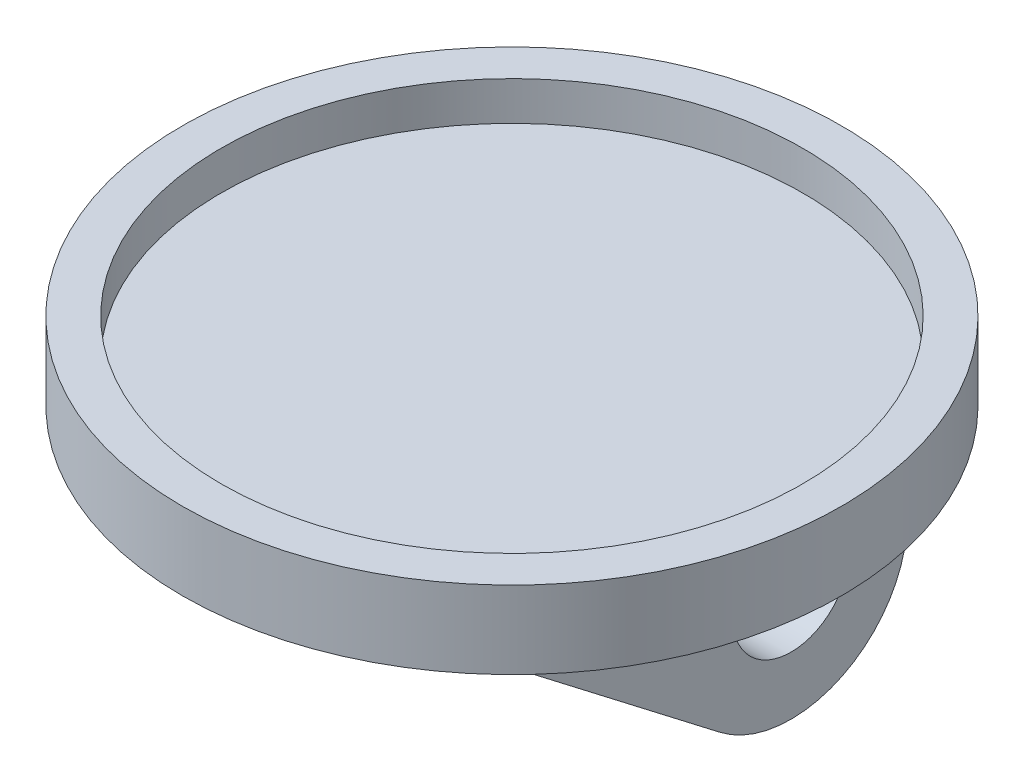
ISO-10303-21;
HEADER;
FILE_DESCRIPTION(('STEP AP214'),'2;1');
FILE_NAME('part.step','',(''),(''),'','','');
FILE_SCHEMA(('AUTOMOTIVE_DESIGN { 1 0 10303 214 1 1 1 1 }'));
ENDSEC;
DATA;
#1=APPLICATION_CONTEXT('core data for automotive mechanical design processes');
#2=APPLICATION_PROTOCOL_DEFINITION('international standard','automotive_design',2000,#1);
#3=PRODUCT_CONTEXT('',#1,'mechanical');
#4=PRODUCT('Part','Part','',(#3));
#5=PRODUCT_RELATED_PRODUCT_CATEGORY('part','',(#4));
#6=PRODUCT_DEFINITION_FORMATION('','',#4);
#7=PRODUCT_DEFINITION_CONTEXT('part definition',#1,'design');
#8=PRODUCT_DEFINITION('design','',#6,#7);
#9=PRODUCT_DEFINITION_SHAPE('','',#8);
#10=(LENGTH_UNIT() NAMED_UNIT(*) SI_UNIT(.MILLI.,.METRE.));
#11=(NAMED_UNIT(*) PLANE_ANGLE_UNIT() SI_UNIT($,.RADIAN.));
#12=(NAMED_UNIT(*) SI_UNIT($,.STERADIAN.) SOLID_ANGLE_UNIT());
#13=UNCERTAINTY_MEASURE_WITH_UNIT(LENGTH_MEASURE(1.E-05),#10,'distance_accuracy_value','');
#14=(GEOMETRIC_REPRESENTATION_CONTEXT(3) GLOBAL_UNCERTAINTY_ASSIGNED_CONTEXT((#13)) GLOBAL_UNIT_ASSIGNED_CONTEXT((#10,
#11,#12)) REPRESENTATION_CONTEXT('',''));
#15=CARTESIAN_POINT('',(0.,0.,0.));
#16=DIRECTION('',(0.,0.,1.));
#17=DIRECTION('',(1.,0.,0.));
#18=AXIS2_PLACEMENT_3D('',#15,#16,#17);
#19=CARTESIAN_POINT('',(0.,0.,0.));
#20=DIRECTION('',(0.,1.,0.));
#21=DIRECTION('',(0.,0.,1.));
#22=AXIS2_PLACEMENT_3D('',#19,#20,#21);
#23=PLANE('',#22);
#24=DIRECTION('',(-1.,0.,0.));
#25=VECTOR('',#24,1.);
#26=CARTESIAN_POINT('',(37.,0.,-65.));
#27=LINE('',#26,#25);
#28=CARTESIAN_POINT('',(37.,0.,-65.));
#29=VERTEX_POINT('',#28);
#30=CARTESIAN_POINT('',(17.,0.,-65.));
#31=VERTEX_POINT('',#30);
#32=EDGE_CURVE('E152',#29,#31,#27,.T.);
#33=ORIENTED_EDGE('',*,*,#32,.T.);
#34=DIRECTION('',(0.,0.,1.));
#35=VECTOR('',#34,1.);
#36=CARTESIAN_POINT('',(17.,0.,65.));
#37=LINE('',#36,#35);
#38=CARTESIAN_POINT('',(17.,0.,65.));
#39=VERTEX_POINT('',#38);
#40=EDGE_CURVE('E146',#31,#39,#37,.T.);
#41=ORIENTED_EDGE('',*,*,#40,.T.);
#42=DIRECTION('',(-1.,0.,0.));
#43=VECTOR('',#42,1.);
#44=CARTESIAN_POINT('',(37.,0.,65.));
#45=LINE('',#44,#43);
#46=CARTESIAN_POINT('',(37.,0.,65.));
#47=VERTEX_POINT('',#46);
#48=EDGE_CURVE('E144',#47,#39,#45,.T.);
#49=ORIENTED_EDGE('',*,*,#48,.F.);
#50=DIRECTION('',(0.,0.,1.));
#51=VECTOR('',#50,1.);
#52=CARTESIAN_POINT('',(37.,0.,65.));
#53=LINE('',#52,#51);
#54=EDGE_CURVE('E137',#29,#47,#53,.T.);
#55=ORIENTED_EDGE('',*,*,#54,.F.);
#56=EDGE_LOOP('',(#33,#41,#49,#55));
#57=FACE_BOUND('',#56,.T.);
#58=CARTESIAN_POINT('',(0.,0.,0.));
#59=DIRECTION('',(0.,1.,0.));
#60=DIRECTION('',(0.,0.,1.));
#61=AXIS2_PLACEMENT_3D('',#58,#59,#60);
#62=CIRCLE('',#61,85.);
#63=CARTESIAN_POINT('',(0.,0.,85.));
#64=VERTEX_POINT('',#63);
#65=EDGE_CURVE('E161',#64,#64,#62,.T.);
#66=ORIENTED_EDGE('',*,*,#65,.F.);
#67=EDGE_LOOP('',(#66));
#68=FACE_BOUND('',#67,.T.);
#69=DIRECTION('',(0.,0.,1.));
#70=VECTOR('',#69,1.);
#71=CARTESIAN_POINT('',(-37.,0.,65.));
#72=LINE('',#71,#70);
#73=CARTESIAN_POINT('',(-37.,0.,-65.));
#74=VERTEX_POINT('',#73);
#75=CARTESIAN_POINT('',(-37.,0.,65.));
#76=VERTEX_POINT('',#75);
#77=EDGE_CURVE('E110',#74,#76,#72,.T.);
#78=ORIENTED_EDGE('',*,*,#77,.T.);
#79=DIRECTION('',(1.,0.,0.));
#80=VECTOR('',#79,1.);
#81=CARTESIAN_POINT('',(-37.,0.,65.));
#82=LINE('',#81,#80);
#83=CARTESIAN_POINT('',(-17.,0.,65.));
#84=VERTEX_POINT('',#83);
#85=EDGE_CURVE('E122',#76,#84,#82,.T.);
#86=ORIENTED_EDGE('',*,*,#85,.T.);
#87=DIRECTION('',(0.,0.,1.));
#88=VECTOR('',#87,1.);
#89=CARTESIAN_POINT('',(-17.,0.,65.));
#90=LINE('',#89,#88);
#91=CARTESIAN_POINT('',(-17.,0.,-65.));
#92=VERTEX_POINT('',#91);
#93=EDGE_CURVE('E121',#92,#84,#90,.T.);
#94=ORIENTED_EDGE('',*,*,#93,.F.);
#95=DIRECTION('',(1.,0.,0.));
#96=VECTOR('',#95,1.);
#97=CARTESIAN_POINT('',(-37.,0.,-65.));
#98=LINE('',#97,#96);
#99=EDGE_CURVE('E106',#74,#92,#98,.T.);
#100=ORIENTED_EDGE('',*,*,#99,.F.);
#101=EDGE_LOOP('',(#78,#86,#94,#100));
#102=FACE_BOUND('',#101,.T.);
#103=ADVANCED_FACE('F41',(#57,#68,#102),#23,.F.);
#104=CARTESIAN_POINT('',(0.,20.,0.));
#105=DIRECTION('',(0.,-1.,0.));
#106=DIRECTION('',(0.,0.,-1.));
#107=AXIS2_PLACEMENT_3D('',#104,#105,#106);
#108=CYLINDRICAL_SURFACE('',#107,85.);
#109=CARTESIAN_POINT('',(0.,20.,0.));
#110=DIRECTION('',(0.,1.,0.));
#111=DIRECTION('',(0.,0.,1.));
#112=AXIS2_PLACEMENT_3D('',#109,#110,#111);
#113=CIRCLE('',#112,85.);
#114=CARTESIAN_POINT('',(0.,20.,85.));
#115=VERTEX_POINT('',#114);
#116=EDGE_CURVE('E162',#115,#115,#113,.T.);
#117=ORIENTED_EDGE('',*,*,#116,.F.);
#118=EDGE_LOOP('',(#117));
#119=FACE_BOUND('',#118,.T.);
#120=ORIENTED_EDGE('',*,*,#65,.T.);
#121=EDGE_LOOP('',(#120));
#122=FACE_BOUND('',#121,.T.);
#123=ADVANCED_FACE('F212',(#119,#122),#108,.T.);
#124=CARTESIAN_POINT('',(0.,20.,0.));
#125=DIRECTION('',(0.,1.,0.));
#126=DIRECTION('',(0.,0.,1.));
#127=AXIS2_PLACEMENT_3D('',#124,#125,#126);
#128=PLANE('',#127);
#129=CARTESIAN_POINT('',(0.,20.,0.));
#130=DIRECTION('',(0.,1.,0.));
#131=DIRECTION('',(0.,0.,1.));
#132=AXIS2_PLACEMENT_3D('',#129,#130,#131);
#133=CIRCLE('',#132,75.);
#134=CARTESIAN_POINT('',(0.,20.,75.));
#135=VERTEX_POINT('',#134);
#136=EDGE_CURVE('E158',#135,#135,#133,.T.);
#137=ORIENTED_EDGE('',*,*,#136,.F.);
#138=EDGE_LOOP('',(#137));
#139=FACE_BOUND('',#138,.T.);
#140=ORIENTED_EDGE('',*,*,#116,.T.);
#141=EDGE_LOOP('',(#140));
#142=FACE_BOUND('',#141,.T.);
#143=ADVANCED_FACE('F218',(#139,#142),#128,.T.);
#144=CARTESIAN_POINT('',(0.,20.,0.));
#145=DIRECTION('',(0.,-1.,0.));
#146=DIRECTION('',(0.,0.,-1.));
#147=AXIS2_PLACEMENT_3D('',#144,#145,#146);
#148=CYLINDRICAL_SURFACE('',#147,75.);
#149=ORIENTED_EDGE('',*,*,#136,.T.);
#150=EDGE_LOOP('',(#149));
#151=FACE_BOUND('',#150,.T.);
#152=CARTESIAN_POINT('',(0.,10.,0.));
#153=DIRECTION('',(0.,1.,0.));
#154=DIRECTION('',(0.,0.,1.));
#155=AXIS2_PLACEMENT_3D('',#152,#153,#154);
#156=CIRCLE('',#155,75.);
#157=CARTESIAN_POINT('',(0.,10.,75.));
#158=VERTEX_POINT('',#157);
#159=EDGE_CURVE('E155',#158,#158,#156,.T.);
#160=ORIENTED_EDGE('',*,*,#159,.F.);
#161=EDGE_LOOP('',(#160));
#162=FACE_BOUND('',#161,.T.);
#163=ADVANCED_FACE('F262',(#151,#162),#148,.F.);
#164=CARTESIAN_POINT('',(0.,10.,0.));
#165=DIRECTION('',(0.,1.,0.));
#166=DIRECTION('',(0.,0.,1.));
#167=AXIS2_PLACEMENT_3D('',#164,#165,#166);
#168=PLANE('',#167);
#169=ORIENTED_EDGE('',*,*,#159,.T.);
#170=EDGE_LOOP('',(#169));
#171=FACE_BOUND('',#170,.T.);
#172=ADVANCED_FACE('F264',(#171),#168,.T.);
#173=CARTESIAN_POINT('',(37.,0.,0.));
#174=DIRECTION('',(1.,0.,0.));
#175=DIRECTION('',(0.,0.,-1.));
#176=AXIS2_PLACEMENT_3D('',#173,#174,#175);
#177=PLANE('',#176);
#178=DIRECTION('',(0.,-0.609710760849692,-0.7926239891046));
#179=VECTOR('',#178,1.);
#180=CARTESIAN_POINT('',(37.,-100.,-65.));
#181=LINE('',#180,#179);
#182=CARTESIAN_POINT('',(37.,-62.8528285957764,-16.7086771745092));
#183=VERTEX_POINT('',#182);
#184=EDGE_CURVE('E141',#47,#183,#181,.T.);
#185=ORIENTED_EDGE('',*,*,#184,.T.);
#186=CARTESIAN_POINT('',(37.,-39.0741089226384,-35.));
#187=DIRECTION('',(1.,0.,0.));
#188=DIRECTION('',(0.,0.,-1.));
#189=AXIS2_PLACEMENT_3D('',#186,#187,#188);
#190=CIRCLE('',#189,30.);
#191=CARTESIAN_POINT('',(37.,-39.0741089226384,-65.));
#192=VERTEX_POINT('',#191);
#193=EDGE_CURVE('E174',#183,#192,#190,.T.);
#194=ORIENTED_EDGE('',*,*,#193,.T.);
#195=DIRECTION('',(0.,1.,0.));
#196=VECTOR('',#195,1.);
#197=CARTESIAN_POINT('',(37.,0.,-65.));
#198=LINE('',#197,#196);
#199=EDGE_CURVE('E135',#192,#29,#198,.T.);
#200=ORIENTED_EDGE('',*,*,#199,.T.);
#201=ORIENTED_EDGE('',*,*,#54,.T.);
#202=EDGE_LOOP('',(#185,#194,#200,#201));
#203=FACE_BOUND('',#202,.T.);
#204=CARTESIAN_POINT('',(37.,-39.0741089226383,-35.));
#205=DIRECTION('',(1.,0.,0.));
#206=DIRECTION('',(0.,0.,-1.));
#207=AXIS2_PLACEMENT_3D('',#204,#205,#206);
#208=CIRCLE('',#207,15.);
#209=CARTESIAN_POINT('',(37.,-39.0741089226383,-50.));
#210=VERTEX_POINT('',#209);
#211=EDGE_CURVE('E129',#210,#210,#208,.T.);
#212=ORIENTED_EDGE('',*,*,#211,.F.);
#213=EDGE_LOOP('',(#212));
#214=FACE_BOUND('',#213,.T.);
#215=ADVANCED_FACE('F234',(#203,#214),#177,.T.);
#216=CARTESIAN_POINT('',(17.,0.,0.));
#217=DIRECTION('',(1.,0.,0.));
#218=DIRECTION('',(0.,0.,-1.));
#219=AXIS2_PLACEMENT_3D('',#216,#217,#218);
#220=PLANE('',#219);
#221=DIRECTION('',(0.,1.,0.));
#222=VECTOR('',#221,1.);
#223=CARTESIAN_POINT('',(17.,0.,-65.));
#224=LINE('',#223,#222);
#225=CARTESIAN_POINT('',(17.,-39.0741089226384,-65.));
#226=VERTEX_POINT('',#225);
#227=EDGE_CURVE('E132',#226,#31,#224,.T.);
#228=ORIENTED_EDGE('',*,*,#227,.F.);
#229=CARTESIAN_POINT('',(17.,-39.0741089226384,-35.));
#230=DIRECTION('',(1.,0.,0.));
#231=DIRECTION('',(0.,0.,-1.));
#232=AXIS2_PLACEMENT_3D('',#229,#230,#231);
#233=CIRCLE('',#232,30.);
#234=CARTESIAN_POINT('',(17.,-62.8528285957764,-16.7086771745092));
#235=VERTEX_POINT('',#234);
#236=EDGE_CURVE('E170',#226,#235,#233,.F.);
#237=ORIENTED_EDGE('',*,*,#236,.T.);
#238=DIRECTION('',(0.,-0.609710760849692,-0.7926239891046));
#239=VECTOR('',#238,1.);
#240=CARTESIAN_POINT('',(17.,-100.,-65.));
#241=LINE('',#240,#239);
#242=EDGE_CURVE('E138',#39,#235,#241,.T.);
#243=ORIENTED_EDGE('',*,*,#242,.F.);
#244=ORIENTED_EDGE('',*,*,#40,.F.);
#245=EDGE_LOOP('',(#228,#237,#243,#244));
#246=FACE_BOUND('',#245,.T.);
#247=CARTESIAN_POINT('',(17.,-39.0741089226383,-35.));
#248=DIRECTION('',(1.,0.,0.));
#249=DIRECTION('',(0.,0.,-1.));
#250=AXIS2_PLACEMENT_3D('',#247,#248,#249);
#251=CIRCLE('',#250,15.);
#252=CARTESIAN_POINT('',(17.,-39.0741089226383,-50.));
#253=VERTEX_POINT('',#252);
#254=EDGE_CURVE('E124',#253,#253,#251,.T.);
#255=ORIENTED_EDGE('',*,*,#254,.T.);
#256=EDGE_LOOP('',(#255));
#257=FACE_BOUND('',#256,.T.);
#258=ADVANCED_FACE('F245',(#246,#257),#220,.F.);
#259=CARTESIAN_POINT('',(37.,0.,-65.));
#260=DIRECTION('',(0.,0.,1.));
#261=DIRECTION('',(0.,-1.,0.));
#262=AXIS2_PLACEMENT_3D('',#259,#260,#261);
#263=PLANE('',#262);
#264=ORIENTED_EDGE('',*,*,#199,.F.);
#265=DIRECTION('',(-1.,0.,0.));
#266=VECTOR('',#265,1.);
#267=CARTESIAN_POINT('',(37.,-39.0741089226384,-65.));
#268=LINE('',#267,#266);
#269=EDGE_CURVE('E165',#192,#226,#268,.T.);
#270=ORIENTED_EDGE('',*,*,#269,.T.);
#271=ORIENTED_EDGE('',*,*,#227,.T.);
#272=ORIENTED_EDGE('',*,*,#32,.F.);
#273=EDGE_LOOP('',(#264,#270,#271,#272));
#274=FACE_BOUND('',#273,.T.);
#275=ADVANCED_FACE('F240',(#274),#263,.F.);
#276=CARTESIAN_POINT('',(37.,-100.,-65.));
#277=DIRECTION('',(0.,0.7926239891046,-0.609710760849692));
#278=DIRECTION('',(0.,0.609710760849693,0.7926239891046));
#279=AXIS2_PLACEMENT_3D('',#276,#277,#278);
#280=PLANE('',#279);
#281=ORIENTED_EDGE('',*,*,#242,.T.);
#282=DIRECTION('',(-1.,0.,0.));
#283=VECTOR('',#282,1.);
#284=CARTESIAN_POINT('',(37.,-62.8528285957763,-16.7086771745092));
#285=LINE('',#284,#283);
#286=EDGE_CURVE('E172',#235,#183,#285,.F.);
#287=ORIENTED_EDGE('',*,*,#286,.T.);
#288=ORIENTED_EDGE('',*,*,#184,.F.);
#289=ORIENTED_EDGE('',*,*,#48,.T.);
#290=EDGE_LOOP('',(#281,#287,#288,#289));
#291=FACE_BOUND('',#290,.T.);
#292=ADVANCED_FACE('F248',(#291),#280,.F.);
#293=CARTESIAN_POINT('',(37.,-39.0741089226383,-35.));
#294=DIRECTION('',(-1.,0.,0.));
#295=DIRECTION('',(0.,0.,1.));
#296=AXIS2_PLACEMENT_3D('',#293,#294,#295);
#297=CYLINDRICAL_SURFACE('',#296,15.);
#298=ORIENTED_EDGE('',*,*,#211,.T.);
#299=EDGE_LOOP('',(#298));
#300=FACE_BOUND('',#299,.T.);
#301=ORIENTED_EDGE('',*,*,#254,.F.);
#302=EDGE_LOOP('',(#301));
#303=FACE_BOUND('',#302,.T.);
#304=ADVANCED_FACE('F250',(#300,#303),#297,.F.);
#305=CARTESIAN_POINT('',(-37.,0.,-65.));
#306=DIRECTION('',(0.,0.,-1.));
#307=DIRECTION('',(0.,1.,0.));
#308=AXIS2_PLACEMENT_3D('',#305,#306,#307);
#309=PLANE('',#308);
#310=DIRECTION('',(0.,1.,0.));
#311=VECTOR('',#310,1.);
#312=CARTESIAN_POINT('',(-17.,0.,-65.));
#313=LINE('',#312,#311);
#314=CARTESIAN_POINT('',(-17.,-39.0741089226384,-65.));
#315=VERTEX_POINT('',#314);
#316=EDGE_CURVE('E185',#315,#92,#313,.T.);
#317=ORIENTED_EDGE('',*,*,#316,.F.);
#318=DIRECTION('',(1.,0.,0.));
#319=VECTOR('',#318,1.);
#320=CARTESIAN_POINT('',(-37.,-39.0741089226384,-65.));
#321=LINE('',#320,#319);
#322=CARTESIAN_POINT('',(-37.,-39.0741089226384,-65.));
#323=VERTEX_POINT('',#322);
#324=EDGE_CURVE('E49',#315,#323,#321,.F.);
#325=ORIENTED_EDGE('',*,*,#324,.T.);
#326=DIRECTION('',(0.,1.,0.));
#327=VECTOR('',#326,1.);
#328=CARTESIAN_POINT('',(-37.,0.,-65.));
#329=LINE('',#328,#327);
#330=EDGE_CURVE('E102',#323,#74,#329,.T.);
#331=ORIENTED_EDGE('',*,*,#330,.T.);
#332=ORIENTED_EDGE('',*,*,#99,.T.);
#333=EDGE_LOOP('',(#317,#325,#331,#332));
#334=FACE_BOUND('',#333,.T.);
#335=ADVANCED_FACE('F104',(#334),#309,.T.);
#336=CARTESIAN_POINT('',(-37.,-100.,-65.));
#337=DIRECTION('',(0.,-0.7926239891046,0.609710760849692));
#338=DIRECTION('',(0.,-0.609710760849693,-0.7926239891046));
#339=AXIS2_PLACEMENT_3D('',#336,#337,#338);
#340=PLANE('',#339);
#341=DIRECTION('',(0.,-0.609710760849692,-0.7926239891046));
#342=VECTOR('',#341,1.);
#343=CARTESIAN_POINT('',(-37.,-100.,-65.));
#344=LINE('',#343,#342);
#345=CARTESIAN_POINT('',(-37.,-62.8528285957764,-16.7086771745092));
#346=VERTEX_POINT('',#345);
#347=EDGE_CURVE('E117',#76,#346,#344,.T.);
#348=ORIENTED_EDGE('',*,*,#347,.T.);
#349=DIRECTION('',(1.,0.,0.));
#350=VECTOR('',#349,1.);
#351=CARTESIAN_POINT('',(-37.,-62.8528285957763,-16.7086771745092));
#352=LINE('',#351,#350);
#353=CARTESIAN_POINT('',(-17.,-62.8528285957764,-16.7086771745092));
#354=VERTEX_POINT('',#353);
#355=EDGE_CURVE('E176',#346,#354,#352,.T.);
#356=ORIENTED_EDGE('',*,*,#355,.T.);
#357=DIRECTION('',(0.,-0.609710760849692,-0.7926239891046));
#358=VECTOR('',#357,1.);
#359=CARTESIAN_POINT('',(-17.,-100.,-65.));
#360=LINE('',#359,#358);
#361=EDGE_CURVE('E111',#84,#354,#360,.T.);
#362=ORIENTED_EDGE('',*,*,#361,.F.);
#363=ORIENTED_EDGE('',*,*,#85,.F.);
#364=EDGE_LOOP('',(#348,#356,#362,#363));
#365=FACE_BOUND('',#364,.T.);
#366=ADVANCED_FACE('F182',(#365),#340,.T.);
#367=CARTESIAN_POINT('',(-37.,0.,0.));
#368=DIRECTION('',(1.,0.,0.));
#369=DIRECTION('',(0.,0.,-1.));
#370=AXIS2_PLACEMENT_3D('',#367,#368,#369);
#371=PLANE('',#370);
#372=CARTESIAN_POINT('',(-37.,-39.0741089226383,-35.));
#373=DIRECTION('',(1.,0.,0.));
#374=DIRECTION('',(0.,0.,-1.));
#375=AXIS2_PLACEMENT_3D('',#372,#373,#374);
#376=CIRCLE('',#375,15.);
#377=CARTESIAN_POINT('',(-37.,-39.0741089226383,-50.));
#378=VERTEX_POINT('',#377);
#379=EDGE_CURVE('E188',#378,#378,#376,.T.);
#380=ORIENTED_EDGE('',*,*,#379,.T.);
#381=EDGE_LOOP('',(#380));
#382=FACE_BOUND('',#381,.T.);
#383=ORIENTED_EDGE('',*,*,#330,.F.);
#384=CARTESIAN_POINT('',(-37.,-39.0741089226384,-35.));
#385=DIRECTION('',(1.,0.,0.));
#386=DIRECTION('',(0.,0.,-1.));
#387=AXIS2_PLACEMENT_3D('',#384,#385,#386);
#388=CIRCLE('',#387,30.);
#389=EDGE_CURVE('E11',#323,#346,#388,.F.);
#390=ORIENTED_EDGE('',*,*,#389,.T.);
#391=ORIENTED_EDGE('',*,*,#347,.F.);
#392=ORIENTED_EDGE('',*,*,#77,.F.);
#393=EDGE_LOOP('',(#383,#390,#391,#392));
#394=FACE_BOUND('',#393,.T.);
#395=ADVANCED_FACE('F115',(#382,#394),#371,.F.);
#396=CARTESIAN_POINT('',(-17.,0.,0.));
#397=DIRECTION('',(1.,0.,0.));
#398=DIRECTION('',(0.,0.,-1.));
#399=AXIS2_PLACEMENT_3D('',#396,#397,#398);
#400=PLANE('',#399);
#401=CARTESIAN_POINT('',(-17.,-39.0741089226383,-35.));
#402=DIRECTION('',(1.,0.,0.));
#403=DIRECTION('',(0.,0.,-1.));
#404=AXIS2_PLACEMENT_3D('',#401,#402,#403);
#405=CIRCLE('',#404,15.);
#406=CARTESIAN_POINT('',(-17.,-39.0741089226383,-50.));
#407=VERTEX_POINT('',#406);
#408=EDGE_CURVE('E190',#407,#407,#405,.T.);
#409=ORIENTED_EDGE('',*,*,#408,.F.);
#410=EDGE_LOOP('',(#409));
#411=FACE_BOUND('',#410,.T.);
#412=ORIENTED_EDGE('',*,*,#361,.T.);
#413=CARTESIAN_POINT('',(-17.,-39.0741089226384,-35.));
#414=DIRECTION('',(1.,0.,0.));
#415=DIRECTION('',(0.,0.,-1.));
#416=AXIS2_PLACEMENT_3D('',#413,#414,#415);
#417=CIRCLE('',#416,30.);
#418=EDGE_CURVE('E63',#354,#315,#417,.T.);
#419=ORIENTED_EDGE('',*,*,#418,.T.);
#420=ORIENTED_EDGE('',*,*,#316,.T.);
#421=ORIENTED_EDGE('',*,*,#93,.T.);
#422=EDGE_LOOP('',(#412,#419,#420,#421));
#423=FACE_BOUND('',#422,.T.);
#424=ADVANCED_FACE('F184',(#411,#423),#400,.T.);
#425=CARTESIAN_POINT('',(-37.,-39.0741089226383,-35.));
#426=DIRECTION('',(1.,0.,0.));
#427=DIRECTION('',(0.,0.,-1.));
#428=AXIS2_PLACEMENT_3D('',#425,#426,#427);
#429=CYLINDRICAL_SURFACE('',#428,15.);
#430=ORIENTED_EDGE('',*,*,#379,.F.);
#431=EDGE_LOOP('',(#430));
#432=FACE_BOUND('',#431,.T.);
#433=ORIENTED_EDGE('',*,*,#408,.T.);
#434=EDGE_LOOP('',(#433));
#435=FACE_BOUND('',#434,.T.);
#436=ADVANCED_FACE('F197',(#432,#435),#429,.F.);
#437=CARTESIAN_POINT('',(37.,-39.0741089226384,-35.));
#438=DIRECTION('',(-1.,0.,0.));
#439=DIRECTION('',(0.,0.,1.));
#440=AXIS2_PLACEMENT_3D('',#437,#438,#439);
#441=CYLINDRICAL_SURFACE('',#440,30.);
#442=ORIENTED_EDGE('',*,*,#193,.F.);
#443=ORIENTED_EDGE('',*,*,#286,.F.);
#444=ORIENTED_EDGE('',*,*,#236,.F.);
#445=ORIENTED_EDGE('',*,*,#269,.F.);
#446=EDGE_LOOP('',(#442,#443,#444,#445));
#447=FACE_BOUND('',#446,.T.);
#448=ADVANCED_FACE('F200',(#447),#441,.T.);
#449=CARTESIAN_POINT('',(-37.,-39.0741089226384,-35.));
#450=DIRECTION('',(1.,0.,0.));
#451=DIRECTION('',(0.,0.,-1.));
#452=AXIS2_PLACEMENT_3D('',#449,#450,#451);
#453=CYLINDRICAL_SURFACE('',#452,30.);
#454=ORIENTED_EDGE('',*,*,#389,.F.);
#455=ORIENTED_EDGE('',*,*,#324,.F.);
#456=ORIENTED_EDGE('',*,*,#418,.F.);
#457=ORIENTED_EDGE('',*,*,#355,.F.);
#458=EDGE_LOOP('',(#454,#455,#456,#457));
#459=FACE_BOUND('',#458,.T.);
#460=ADVANCED_FACE('F43',(#459),#453,.T.);
#461=CLOSED_SHELL('',(#103,#123,#143,#163,#172,#215,#258,#275,#292,#304,#335,#366,#395,#424,
#436,#448,#460));
#462=MANIFOLD_SOLID_BREP('B2',#461);
#463=ADVANCED_BREP_SHAPE_REPRESENTATION('',(#18,#462),#14);
#464=SHAPE_DEFINITION_REPRESENTATION(#9,#463);
ENDSEC;
END-ISO-10303-21;
